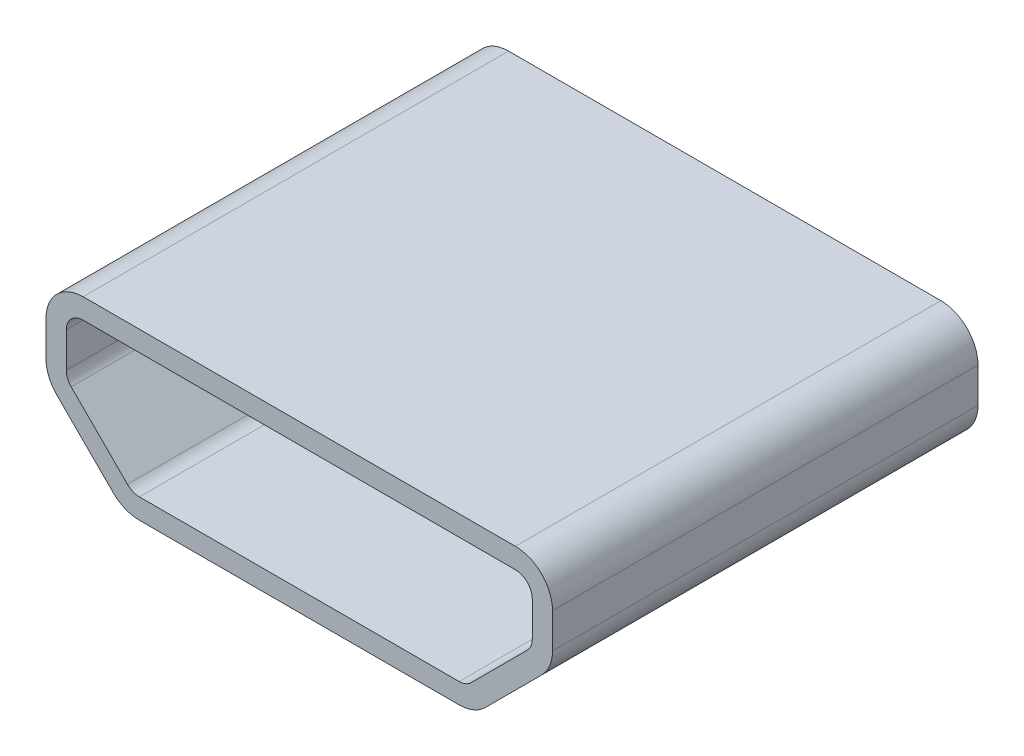
ISO-10303-21;
HEADER;
FILE_DESCRIPTION(('STEP AP214'),'2;1');
FILE_NAME('part.step','',(''),(''),'','','');
FILE_SCHEMA(('AUTOMOTIVE_DESIGN { 1 0 10303 214 1 1 1 1 }'));
ENDSEC;
DATA;
#1=APPLICATION_CONTEXT('core data for automotive mechanical design processes');
#2=APPLICATION_PROTOCOL_DEFINITION('international standard','automotive_design',2000,#1);
#3=PRODUCT_CONTEXT('',#1,'mechanical');
#4=PRODUCT('Part','Part','',(#3));
#5=PRODUCT_RELATED_PRODUCT_CATEGORY('part','',(#4));
#6=PRODUCT_DEFINITION_FORMATION('','',#4);
#7=PRODUCT_DEFINITION_CONTEXT('part definition',#1,'design');
#8=PRODUCT_DEFINITION('design','',#6,#7);
#9=PRODUCT_DEFINITION_SHAPE('','',#8);
#10=(LENGTH_UNIT() NAMED_UNIT(*) SI_UNIT(.MILLI.,.METRE.));
#11=(NAMED_UNIT(*) PLANE_ANGLE_UNIT() SI_UNIT($,.RADIAN.));
#12=(NAMED_UNIT(*) SI_UNIT($,.STERADIAN.) SOLID_ANGLE_UNIT());
#13=UNCERTAINTY_MEASURE_WITH_UNIT(LENGTH_MEASURE(1.E-05),#10,'distance_accuracy_value','');
#14=(GEOMETRIC_REPRESENTATION_CONTEXT(3) GLOBAL_UNCERTAINTY_ASSIGNED_CONTEXT((#13)) GLOBAL_UNIT_ASSIGNED_CONTEXT((#10,
#11,#12)) REPRESENTATION_CONTEXT('',''));
#15=CARTESIAN_POINT('',(0.,0.,0.));
#16=DIRECTION('',(0.,0.,1.));
#17=DIRECTION('',(1.,0.,0.));
#18=AXIS2_PLACEMENT_3D('',#15,#16,#17);
#19=CARTESIAN_POINT('',(-3.2,0.674999999999999,3.15));
#20=DIRECTION('',(0.,0.,-1.));
#21=DIRECTION('',(-1.,0.,0.));
#22=AXIS2_PLACEMENT_3D('',#19,#20,#21);
#23=CYLINDRICAL_SURFACE('',#22,0.55);
#24=DIRECTION('',(0.,0.,-1.));
#25=VECTOR('',#24,1.);
#26=CARTESIAN_POINT('',(-3.2,1.225,3.15));
#27=LINE('',#26,#25);
#28=CARTESIAN_POINT('',(-3.2,1.225,3.15));
#29=VERTEX_POINT('',#28);
#30=CARTESIAN_POINT('',(-3.2,1.225,-3.15));
#31=VERTEX_POINT('',#30);
#32=EDGE_CURVE('E113',#29,#31,#27,.T.);
#33=ORIENTED_EDGE('',*,*,#32,.T.);
#34=CARTESIAN_POINT('',(-3.2,0.674999999999999,-3.15));
#35=DIRECTION('',(0.,0.,1.));
#36=DIRECTION('',(1.,0.,0.));
#37=AXIS2_PLACEMENT_3D('',#34,#35,#36);
#38=CIRCLE('',#37,0.55);
#39=CARTESIAN_POINT('',(-3.75,0.674999999999999,-3.15));
#40=VERTEX_POINT('',#39);
#41=EDGE_CURVE('E180',#31,#40,#38,.T.);
#42=ORIENTED_EDGE('',*,*,#41,.T.);
#43=DIRECTION('',(0.,0.,-1.));
#44=VECTOR('',#43,1.);
#45=CARTESIAN_POINT('',(-3.75,0.674999999999999,3.15));
#46=LINE('',#45,#44);
#47=CARTESIAN_POINT('',(-3.75,0.674999999999999,3.15));
#48=VERTEX_POINT('',#47);
#49=EDGE_CURVE('E12',#48,#40,#46,.T.);
#50=ORIENTED_EDGE('',*,*,#49,.F.);
#51=CARTESIAN_POINT('',(-3.2,0.674999999999999,3.15));
#52=DIRECTION('',(0.,0.,1.));
#53=DIRECTION('',(1.,0.,0.));
#54=AXIS2_PLACEMENT_3D('',#51,#52,#53);
#55=CIRCLE('',#54,0.55);
#56=EDGE_CURVE('E224',#29,#48,#55,.T.);
#57=ORIENTED_EDGE('',*,*,#56,.F.);
#58=EDGE_LOOP('',(#33,#42,#50,#57));
#59=FACE_BOUND('',#58,.T.);
#60=ADVANCED_FACE('F45',(#59),#23,.T.);
#61=CARTESIAN_POINT('',(-3.75,0.674999999999999,3.15));
#62=DIRECTION('',(1.,0.,0.));
#63=DIRECTION('',(0.,1.,0.));
#64=AXIS2_PLACEMENT_3D('',#61,#62,#63);
#65=PLANE('',#64);
#66=ORIENTED_EDGE('',*,*,#49,.T.);
#67=DIRECTION('',(0.,-1.,0.));
#68=VECTOR('',#67,1.);
#69=CARTESIAN_POINT('',(-3.75,0.674999999999999,-3.15));
#70=LINE('',#69,#68);
#71=CARTESIAN_POINT('',(-3.75,0.157817459305192,-3.15));
#72=VERTEX_POINT('',#71);
#73=EDGE_CURVE('E183',#40,#72,#70,.T.);
#74=ORIENTED_EDGE('',*,*,#73,.T.);
#75=DIRECTION('',(0.,0.,-1.));
#76=VECTOR('',#75,1.);
#77=CARTESIAN_POINT('',(-3.75,0.157817459305192,3.15));
#78=LINE('',#77,#76);
#79=CARTESIAN_POINT('',(-3.75,0.157817459305192,3.15));
#80=VERTEX_POINT('',#79);
#81=EDGE_CURVE('E53',#80,#72,#78,.T.);
#82=ORIENTED_EDGE('',*,*,#81,.F.);
#83=DIRECTION('',(0.,-1.,0.));
#84=VECTOR('',#83,1.);
#85=CARTESIAN_POINT('',(-3.75,0.674999999999999,3.15));
#86=LINE('',#85,#84);
#87=EDGE_CURVE('E121',#48,#80,#86,.T.);
#88=ORIENTED_EDGE('',*,*,#87,.F.);
#89=EDGE_LOOP('',(#66,#74,#82,#88));
#90=FACE_BOUND('',#89,.T.);
#91=ADVANCED_FACE('F257',(#90),#65,.F.);
#92=CARTESIAN_POINT('',(-3.2,0.157817459305192,3.15));
#93=DIRECTION('',(0.,0.,-1.));
#94=DIRECTION('',(-1.,0.,0.));
#95=AXIS2_PLACEMENT_3D('',#92,#93,#94);
#96=CYLINDRICAL_SURFACE('',#95,0.55);
#97=ORIENTED_EDGE('',*,*,#81,.T.);
#98=CARTESIAN_POINT('',(-3.2,0.157817459305192,-3.15));
#99=DIRECTION('',(0.,0.,1.));
#100=DIRECTION('',(-1.,0.,0.));
#101=AXIS2_PLACEMENT_3D('',#98,#99,#100);
#102=CIRCLE('',#101,0.55);
#103=CARTESIAN_POINT('',(-3.5889087296526,-0.231091270347411,-3.15));
#104=VERTEX_POINT('',#103);
#105=EDGE_CURVE('E188',#72,#104,#102,.T.);
#106=ORIENTED_EDGE('',*,*,#105,.T.);
#107=DIRECTION('',(0.,0.,-1.));
#108=VECTOR('',#107,1.);
#109=CARTESIAN_POINT('',(-3.5889087296526,-0.231091270347411,3.15));
#110=LINE('',#109,#108);
#111=CARTESIAN_POINT('',(-3.5889087296526,-0.231091270347411,3.15));
#112=VERTEX_POINT('',#111);
#113=EDGE_CURVE('E246',#112,#104,#110,.T.);
#114=ORIENTED_EDGE('',*,*,#113,.F.);
#115=CARTESIAN_POINT('',(-3.2,0.157817459305192,3.15));
#116=DIRECTION('',(0.,0.,1.));
#117=DIRECTION('',(-1.,0.,0.));
#118=AXIS2_PLACEMENT_3D('',#115,#116,#117);
#119=CIRCLE('',#118,0.55);
#120=EDGE_CURVE('E255',#80,#112,#119,.T.);
#121=ORIENTED_EDGE('',*,*,#120,.F.);
#122=EDGE_LOOP('',(#97,#106,#114,#121));
#123=FACE_BOUND('',#122,.T.);
#124=ADVANCED_FACE('F251',(#123),#96,.T.);
#125=CARTESIAN_POINT('',(-2.7560912703474,-1.0639087296526,3.15));
#126=DIRECTION('',(0.707106781186544,0.707106781186551,0.));
#127=DIRECTION('',(-0.707106781186551,0.707106781186544,0.));
#128=AXIS2_PLACEMENT_3D('',#125,#126,#127);
#129=PLANE('',#128);
#130=ORIENTED_EDGE('',*,*,#113,.T.);
#131=DIRECTION('',(0.707106781186551,-0.707106781186544,0.));
#132=VECTOR('',#131,1.);
#133=CARTESIAN_POINT('',(-2.7560912703474,-1.0639087296526,-3.15));
#134=LINE('',#133,#132);
#135=CARTESIAN_POINT('',(-2.7560912703474,-1.0639087296526,-3.15));
#136=VERTEX_POINT('',#135);
#137=EDGE_CURVE('E192',#104,#136,#134,.T.);
#138=ORIENTED_EDGE('',*,*,#137,.T.);
#139=DIRECTION('',(0.,0.,-1.));
#140=VECTOR('',#139,1.);
#141=CARTESIAN_POINT('',(-2.7560912703474,-1.0639087296526,3.15));
#142=LINE('',#141,#140);
#143=CARTESIAN_POINT('',(-2.7560912703474,-1.0639087296526,3.15));
#144=VERTEX_POINT('',#143);
#145=EDGE_CURVE('E243',#144,#136,#142,.T.);
#146=ORIENTED_EDGE('',*,*,#145,.F.);
#147=DIRECTION('',(0.707106781186551,-0.707106781186544,0.));
#148=VECTOR('',#147,1.);
#149=CARTESIAN_POINT('',(-2.7560912703474,-1.0639087296526,3.15));
#150=LINE('',#149,#148);
#151=EDGE_CURVE('E269',#112,#144,#150,.T.);
#152=ORIENTED_EDGE('',*,*,#151,.F.);
#153=EDGE_LOOP('',(#130,#138,#146,#152));
#154=FACE_BOUND('',#153,.T.);
#155=ADVANCED_FACE('F266',(#154),#129,.F.);
#156=CARTESIAN_POINT('',(-2.3671825406948,-0.675,3.15));
#157=DIRECTION('',(0.,0.,-1.));
#158=DIRECTION('',(-1.,0.,0.));
#159=AXIS2_PLACEMENT_3D('',#156,#157,#158);
#160=CYLINDRICAL_SURFACE('',#159,0.55);
#161=ORIENTED_EDGE('',*,*,#145,.T.);
#162=CARTESIAN_POINT('',(-2.3671825406948,-0.675,-3.15));
#163=DIRECTION('',(0.,0.,1.));
#164=DIRECTION('',(-1.,0.,0.));
#165=AXIS2_PLACEMENT_3D('',#162,#163,#164);
#166=CIRCLE('',#165,0.55);
#167=CARTESIAN_POINT('',(-2.3671825406948,-1.225,-3.15));
#168=VERTEX_POINT('',#167);
#169=EDGE_CURVE('E196',#136,#168,#166,.T.);
#170=ORIENTED_EDGE('',*,*,#169,.T.);
#171=DIRECTION('',(0.,0.,-1.));
#172=VECTOR('',#171,1.);
#173=CARTESIAN_POINT('',(-2.3671825406948,-1.225,3.15));
#174=LINE('',#173,#172);
#175=CARTESIAN_POINT('',(-2.3671825406948,-1.225,3.15));
#176=VERTEX_POINT('',#175);
#177=EDGE_CURVE('E240',#176,#168,#174,.T.);
#178=ORIENTED_EDGE('',*,*,#177,.F.);
#179=CARTESIAN_POINT('',(-2.3671825406948,-0.675,3.15));
#180=DIRECTION('',(0.,0.,1.));
#181=DIRECTION('',(-1.,0.,0.));
#182=AXIS2_PLACEMENT_3D('',#179,#180,#181);
#183=CIRCLE('',#182,0.55);
#184=EDGE_CURVE('E271',#144,#176,#183,.T.);
#185=ORIENTED_EDGE('',*,*,#184,.F.);
#186=EDGE_LOOP('',(#161,#170,#178,#185));
#187=FACE_BOUND('',#186,.T.);
#188=ADVANCED_FACE('F565',(#187),#160,.T.);
#189=CARTESIAN_POINT('',(-2.3671825406948,-1.225,3.15));
#190=DIRECTION('',(0.,1.,0.));
#191=DIRECTION('',(-1.,0.,0.));
#192=AXIS2_PLACEMENT_3D('',#189,#190,#191);
#193=PLANE('',#192);
#194=ORIENTED_EDGE('',*,*,#177,.T.);
#195=DIRECTION('',(1.,0.,0.));
#196=VECTOR('',#195,1.);
#197=CARTESIAN_POINT('',(-2.3671825406948,-1.225,-3.15));
#198=LINE('',#197,#196);
#199=CARTESIAN_POINT('',(2.3671825406948,-1.225,-3.15));
#200=VERTEX_POINT('',#199);
#201=EDGE_CURVE('E200',#168,#200,#198,.T.);
#202=ORIENTED_EDGE('',*,*,#201,.T.);
#203=DIRECTION('',(0.,0.,-1.));
#204=VECTOR('',#203,1.);
#205=CARTESIAN_POINT('',(2.3671825406948,-1.225,3.15));
#206=LINE('',#205,#204);
#207=CARTESIAN_POINT('',(2.3671825406948,-1.225,3.15));
#208=VERTEX_POINT('',#207);
#209=EDGE_CURVE('E237',#208,#200,#206,.T.);
#210=ORIENTED_EDGE('',*,*,#209,.F.);
#211=DIRECTION('',(1.,0.,0.));
#212=VECTOR('',#211,1.);
#213=CARTESIAN_POINT('',(-2.3671825406948,-1.225,3.15));
#214=LINE('',#213,#212);
#215=EDGE_CURVE('E275',#176,#208,#214,.T.);
#216=ORIENTED_EDGE('',*,*,#215,.F.);
#217=EDGE_LOOP('',(#194,#202,#210,#216));
#218=FACE_BOUND('',#217,.T.);
#219=ADVANCED_FACE('F568',(#218),#193,.F.);
#220=CARTESIAN_POINT('',(2.3671825406948,-0.675,3.15));
#221=DIRECTION('',(0.,0.,-1.));
#222=DIRECTION('',(-1.,0.,0.));
#223=AXIS2_PLACEMENT_3D('',#220,#221,#222);
#224=CYLINDRICAL_SURFACE('',#223,0.55);
#225=ORIENTED_EDGE('',*,*,#209,.T.);
#226=CARTESIAN_POINT('',(2.3671825406948,-0.675,-3.15));
#227=DIRECTION('',(0.,0.,1.));
#228=DIRECTION('',(1.,0.,0.));
#229=AXIS2_PLACEMENT_3D('',#226,#227,#228);
#230=CIRCLE('',#229,0.55);
#231=CARTESIAN_POINT('',(2.7560912703474,-1.0639087296526,-3.15));
#232=VERTEX_POINT('',#231);
#233=EDGE_CURVE('E204',#200,#232,#230,.T.);
#234=ORIENTED_EDGE('',*,*,#233,.T.);
#235=DIRECTION('',(0.,0.,-1.));
#236=VECTOR('',#235,1.);
#237=CARTESIAN_POINT('',(2.7560912703474,-1.0639087296526,3.15));
#238=LINE('',#237,#236);
#239=CARTESIAN_POINT('',(2.7560912703474,-1.0639087296526,3.15));
#240=VERTEX_POINT('',#239);
#241=EDGE_CURVE('E234',#240,#232,#238,.T.);
#242=ORIENTED_EDGE('',*,*,#241,.F.);
#243=CARTESIAN_POINT('',(2.3671825406948,-0.675,3.15));
#244=DIRECTION('',(0.,0.,1.));
#245=DIRECTION('',(1.,0.,0.));
#246=AXIS2_PLACEMENT_3D('',#243,#244,#245);
#247=CIRCLE('',#246,0.55);
#248=EDGE_CURVE('E282',#208,#240,#247,.T.);
#249=ORIENTED_EDGE('',*,*,#248,.F.);
#250=EDGE_LOOP('',(#225,#234,#242,#249));
#251=FACE_BOUND('',#250,.T.);
#252=ADVANCED_FACE('F572',(#251),#224,.T.);
#253=CARTESIAN_POINT('',(2.7560912703474,-1.0639087296526,3.15));
#254=DIRECTION('',(-0.707106781186544,0.707106781186551,0.));
#255=DIRECTION('',(-0.707106781186551,-0.707106781186544,0.));
#256=AXIS2_PLACEMENT_3D('',#253,#254,#255);
#257=PLANE('',#256);
#258=ORIENTED_EDGE('',*,*,#241,.T.);
#259=DIRECTION('',(0.707106781186551,0.707106781186544,0.));
#260=VECTOR('',#259,1.);
#261=CARTESIAN_POINT('',(2.7560912703474,-1.0639087296526,-3.15));
#262=LINE('',#261,#260);
#263=CARTESIAN_POINT('',(3.5889087296526,-0.231091270347412,-3.15));
#264=VERTEX_POINT('',#263);
#265=EDGE_CURVE('E208',#232,#264,#262,.T.);
#266=ORIENTED_EDGE('',*,*,#265,.T.);
#267=DIRECTION('',(0.,0.,-1.));
#268=VECTOR('',#267,1.);
#269=CARTESIAN_POINT('',(3.5889087296526,-0.231091270347412,3.15));
#270=LINE('',#269,#268);
#271=CARTESIAN_POINT('',(3.5889087296526,-0.231091270347412,3.15));
#272=VERTEX_POINT('',#271);
#273=EDGE_CURVE('E231',#272,#264,#270,.T.);
#274=ORIENTED_EDGE('',*,*,#273,.F.);
#275=DIRECTION('',(0.707106781186551,0.707106781186544,0.));
#276=VECTOR('',#275,1.);
#277=CARTESIAN_POINT('',(2.7560912703474,-1.0639087296526,3.15));
#278=LINE('',#277,#276);
#279=EDGE_CURVE('E285',#240,#272,#278,.T.);
#280=ORIENTED_EDGE('',*,*,#279,.F.);
#281=EDGE_LOOP('',(#258,#266,#274,#280));
#282=FACE_BOUND('',#281,.T.);
#283=ADVANCED_FACE('F293',(#282),#257,.F.);
#284=CARTESIAN_POINT('',(3.2,0.157817459305192,3.15));
#285=DIRECTION('',(0.,0.,-1.));
#286=DIRECTION('',(-1.,0.,0.));
#287=AXIS2_PLACEMENT_3D('',#284,#285,#286);
#288=CYLINDRICAL_SURFACE('',#287,0.55);
#289=ORIENTED_EDGE('',*,*,#273,.T.);
#290=CARTESIAN_POINT('',(3.2,0.157817459305192,-3.15));
#291=DIRECTION('',(0.,0.,1.));
#292=DIRECTION('',(1.,0.,0.));
#293=AXIS2_PLACEMENT_3D('',#290,#291,#292);
#294=CIRCLE('',#293,0.55);
#295=CARTESIAN_POINT('',(3.75,0.157817459305191,-3.15));
#296=VERTEX_POINT('',#295);
#297=EDGE_CURVE('E212',#264,#296,#294,.T.);
#298=ORIENTED_EDGE('',*,*,#297,.T.);
#299=DIRECTION('',(0.,0.,-1.));
#300=VECTOR('',#299,1.);
#301=CARTESIAN_POINT('',(3.75,0.157817459305191,3.15));
#302=LINE('',#301,#300);
#303=CARTESIAN_POINT('',(3.75,0.157817459305191,3.15));
#304=VERTEX_POINT('',#303);
#305=EDGE_CURVE('E170',#304,#296,#302,.T.);
#306=ORIENTED_EDGE('',*,*,#305,.F.);
#307=CARTESIAN_POINT('',(3.2,0.157817459305192,3.15));
#308=DIRECTION('',(0.,0.,1.));
#309=DIRECTION('',(1.,0.,0.));
#310=AXIS2_PLACEMENT_3D('',#307,#308,#309);
#311=CIRCLE('',#310,0.55);
#312=EDGE_CURVE('E156',#272,#304,#311,.T.);
#313=ORIENTED_EDGE('',*,*,#312,.F.);
#314=EDGE_LOOP('',(#289,#298,#306,#313));
#315=FACE_BOUND('',#314,.T.);
#316=ADVANCED_FACE('F297',(#315),#288,.T.);
#317=CARTESIAN_POINT('',(3.75,0.674999999999999,3.15));
#318=DIRECTION('',(-1.,0.,0.));
#319=DIRECTION('',(0.,-1.,0.));
#320=AXIS2_PLACEMENT_3D('',#317,#318,#319);
#321=PLANE('',#320);
#322=ORIENTED_EDGE('',*,*,#305,.T.);
#323=DIRECTION('',(0.,1.,0.));
#324=VECTOR('',#323,1.);
#325=CARTESIAN_POINT('',(3.75,0.674999999999999,-3.15));
#326=LINE('',#325,#324);
#327=CARTESIAN_POINT('',(3.75,0.674999999999999,-3.15));
#328=VERTEX_POINT('',#327);
#329=EDGE_CURVE('E165',#296,#328,#326,.T.);
#330=ORIENTED_EDGE('',*,*,#329,.T.);
#331=DIRECTION('',(0.,0.,-1.));
#332=VECTOR('',#331,1.);
#333=CARTESIAN_POINT('',(3.75,0.674999999999999,3.15));
#334=LINE('',#333,#332);
#335=CARTESIAN_POINT('',(3.75,0.674999999999999,3.15));
#336=VERTEX_POINT('',#335);
#337=EDGE_CURVE('E162',#336,#328,#334,.T.);
#338=ORIENTED_EDGE('',*,*,#337,.F.);
#339=DIRECTION('',(0.,1.,0.));
#340=VECTOR('',#339,1.);
#341=CARTESIAN_POINT('',(3.75,0.674999999999999,3.15));
#342=LINE('',#341,#340);
#343=EDGE_CURVE('E149',#304,#336,#342,.T.);
#344=ORIENTED_EDGE('',*,*,#343,.F.);
#345=EDGE_LOOP('',(#322,#330,#338,#344));
#346=FACE_BOUND('',#345,.T.);
#347=ADVANCED_FACE('F163',(#346),#321,.F.);
#348=CARTESIAN_POINT('',(3.2,0.674999999999999,3.15));
#349=DIRECTION('',(0.,0.,-1.));
#350=DIRECTION('',(-1.,0.,0.));
#351=AXIS2_PLACEMENT_3D('',#348,#349,#350);
#352=CYLINDRICAL_SURFACE('',#351,0.55);
#353=ORIENTED_EDGE('',*,*,#337,.T.);
#354=CARTESIAN_POINT('',(3.2,0.674999999999999,-3.15));
#355=DIRECTION('',(0.,0.,1.));
#356=DIRECTION('',(-1.,0.,0.));
#357=AXIS2_PLACEMENT_3D('',#354,#355,#356);
#358=CIRCLE('',#357,0.55);
#359=CARTESIAN_POINT('',(3.2,1.225,-3.15));
#360=VERTEX_POINT('',#359);
#361=EDGE_CURVE('E218',#328,#360,#358,.T.);
#362=ORIENTED_EDGE('',*,*,#361,.T.);
#363=DIRECTION('',(0.,0.,-1.));
#364=VECTOR('',#363,1.);
#365=CARTESIAN_POINT('',(3.2,1.225,3.15));
#366=LINE('',#365,#364);
#367=CARTESIAN_POINT('',(3.2,1.225,3.15));
#368=VERTEX_POINT('',#367);
#369=EDGE_CURVE('E171',#368,#360,#366,.T.);
#370=ORIENTED_EDGE('',*,*,#369,.F.);
#371=CARTESIAN_POINT('',(3.2,0.674999999999999,3.15));
#372=DIRECTION('',(0.,0.,1.));
#373=DIRECTION('',(-1.,0.,0.));
#374=AXIS2_PLACEMENT_3D('',#371,#372,#373);
#375=CIRCLE('',#374,0.55);
#376=EDGE_CURVE('E153',#336,#368,#375,.T.);
#377=ORIENTED_EDGE('',*,*,#376,.F.);
#378=EDGE_LOOP('',(#353,#362,#370,#377));
#379=FACE_BOUND('',#378,.T.);
#380=ADVANCED_FACE('F173',(#379),#352,.T.);
#381=CARTESIAN_POINT('',(3.2,1.225,3.15));
#382=DIRECTION('',(0.,-1.,0.));
#383=DIRECTION('',(0.,0.,-1.));
#384=AXIS2_PLACEMENT_3D('',#381,#382,#383);
#385=PLANE('',#384);
#386=ORIENTED_EDGE('',*,*,#369,.T.);
#387=DIRECTION('',(-1.,0.,0.));
#388=VECTOR('',#387,1.);
#389=CARTESIAN_POINT('',(3.2,1.225,-3.15));
#390=LINE('',#389,#388);
#391=EDGE_CURVE('E221',#360,#31,#390,.T.);
#392=ORIENTED_EDGE('',*,*,#391,.T.);
#393=ORIENTED_EDGE('',*,*,#32,.F.);
#394=DIRECTION('',(-1.,0.,0.));
#395=VECTOR('',#394,1.);
#396=CARTESIAN_POINT('',(3.2,1.225,3.15));
#397=LINE('',#396,#395);
#398=EDGE_CURVE('E69',#368,#29,#397,.T.);
#399=ORIENTED_EDGE('',*,*,#398,.F.);
#400=EDGE_LOOP('',(#386,#392,#393,#399));
#401=FACE_BOUND('',#400,.T.);
#402=ADVANCED_FACE('F300',(#401),#385,.F.);
#403=CARTESIAN_POINT('',(-3.2,0.674999999999999,3.15));
#404=DIRECTION('',(0.,0.,1.));
#405=DIRECTION('',(1.,0.,0.));
#406=AXIS2_PLACEMENT_3D('',#403,#404,#405);
#407=PLANE('',#406);
#408=CARTESIAN_POINT('',(-3.2,0.674999999999999,3.15));
#409=DIRECTION('',(0.,0.,1.));
#410=DIRECTION('',(1.,0.,0.));
#411=AXIS2_PLACEMENT_3D('',#408,#409,#410);
#412=CIRCLE('',#411,0.25);
#413=CARTESIAN_POINT('',(-3.2,0.924999999999999,3.15));
#414=VERTEX_POINT('',#413);
#415=CARTESIAN_POINT('',(-3.45,0.674999999999999,3.15));
#416=VERTEX_POINT('',#415);
#417=EDGE_CURVE('E60',#414,#416,#412,.T.);
#418=ORIENTED_EDGE('',*,*,#417,.F.);
#419=DIRECTION('',(-1.,0.,0.));
#420=VECTOR('',#419,1.);
#421=CARTESIAN_POINT('',(3.2,0.924999999999999,3.15));
#422=LINE('',#421,#420);
#423=CARTESIAN_POINT('',(3.2,0.924999999999999,3.15));
#424=VERTEX_POINT('',#423);
#425=EDGE_CURVE('E351',#424,#414,#422,.T.);
#426=ORIENTED_EDGE('',*,*,#425,.F.);
#427=CARTESIAN_POINT('',(3.2,0.674999999999999,3.15));
#428=DIRECTION('',(0.,0.,1.));
#429=DIRECTION('',(1.,0.,0.));
#430=AXIS2_PLACEMENT_3D('',#427,#428,#429);
#431=CIRCLE('',#430,0.25);
#432=CARTESIAN_POINT('',(3.45,0.675,3.15));
#433=VERTEX_POINT('',#432);
#434=EDGE_CURVE('E356',#433,#424,#431,.T.);
#435=ORIENTED_EDGE('',*,*,#434,.F.);
#436=DIRECTION('',(0.,1.,0.));
#437=VECTOR('',#436,1.);
#438=CARTESIAN_POINT('',(3.45,0.157817459305191,3.15));
#439=LINE('',#438,#437);
#440=CARTESIAN_POINT('',(3.45,0.157817459305191,3.15));
#441=VERTEX_POINT('',#440);
#442=EDGE_CURVE('E360',#441,#433,#439,.T.);
#443=ORIENTED_EDGE('',*,*,#442,.F.);
#444=CARTESIAN_POINT('',(3.2,0.157817459305192,3.15));
#445=DIRECTION('',(0.,0.,1.));
#446=DIRECTION('',(1.,0.,0.));
#447=AXIS2_PLACEMENT_3D('',#444,#445,#446);
#448=CIRCLE('',#447,0.25);
#449=CARTESIAN_POINT('',(3.37677669529663,-0.0189592359914465,3.15));
#450=VERTEX_POINT('',#449);
#451=EDGE_CURVE('E364',#450,#441,#448,.T.);
#452=ORIENTED_EDGE('',*,*,#451,.F.);
#453=DIRECTION('',(0.707106781186551,0.707106781186544,0.));
#454=VECTOR('',#453,1.);
#455=CARTESIAN_POINT('',(2.54395923599144,-0.851776695296637,3.15));
#456=LINE('',#455,#454);
#457=CARTESIAN_POINT('',(2.54395923599144,-0.851776695296637,3.15));
#458=VERTEX_POINT('',#457);
#459=EDGE_CURVE('E368',#458,#450,#456,.T.);
#460=ORIENTED_EDGE('',*,*,#459,.F.);
#461=CARTESIAN_POINT('',(2.3671825406948,-0.675,3.15));
#462=DIRECTION('',(0.,0.,1.));
#463=DIRECTION('',(1.,0.,0.));
#464=AXIS2_PLACEMENT_3D('',#461,#462,#463);
#465=CIRCLE('',#464,0.25);
#466=CARTESIAN_POINT('',(2.3671825406948,-0.925,3.15));
#467=VERTEX_POINT('',#466);
#468=EDGE_CURVE('E372',#467,#458,#465,.T.);
#469=ORIENTED_EDGE('',*,*,#468,.F.);
#470=DIRECTION('',(1.,0.,0.));
#471=VECTOR('',#470,1.);
#472=CARTESIAN_POINT('',(-2.3671825406948,-0.925,3.15));
#473=LINE('',#472,#471);
#474=CARTESIAN_POINT('',(-2.3671825406948,-0.925,3.15));
#475=VERTEX_POINT('',#474);
#476=EDGE_CURVE('E376',#475,#467,#473,.T.);
#477=ORIENTED_EDGE('',*,*,#476,.F.);
#478=CARTESIAN_POINT('',(-2.3671825406948,-0.675,3.15));
#479=DIRECTION('',(0.,0.,1.));
#480=DIRECTION('',(1.,0.,0.));
#481=AXIS2_PLACEMENT_3D('',#478,#479,#480);
#482=CIRCLE('',#481,0.25);
#483=CARTESIAN_POINT('',(-2.54395923599144,-0.851776695296637,3.15));
#484=VERTEX_POINT('',#483);
#485=EDGE_CURVE('E380',#484,#475,#482,.T.);
#486=ORIENTED_EDGE('',*,*,#485,.F.);
#487=DIRECTION('',(0.707106781186552,-0.707106781186543,0.));
#488=VECTOR('',#487,1.);
#489=CARTESIAN_POINT('',(-3.37677669529664,-0.0189592359914461,3.15));
#490=LINE('',#489,#488);
#491=CARTESIAN_POINT('',(-3.37677669529664,-0.0189592359914461,3.15));
#492=VERTEX_POINT('',#491);
#493=EDGE_CURVE('E384',#492,#484,#490,.T.);
#494=ORIENTED_EDGE('',*,*,#493,.F.);
#495=CARTESIAN_POINT('',(-3.2,0.157817459305192,3.15));
#496=DIRECTION('',(0.,0.,1.));
#497=DIRECTION('',(1.,0.,0.));
#498=AXIS2_PLACEMENT_3D('',#495,#496,#497);
#499=CIRCLE('',#498,0.25);
#500=CARTESIAN_POINT('',(-3.45,0.157817459305192,3.15));
#501=VERTEX_POINT('',#500);
#502=EDGE_CURVE('E388',#501,#492,#499,.T.);
#503=ORIENTED_EDGE('',*,*,#502,.F.);
#504=DIRECTION('',(0.,-1.,0.));
#505=VECTOR('',#504,1.);
#506=CARTESIAN_POINT('',(-3.45,0.674999999999999,3.15));
#507=LINE('',#506,#505);
#508=EDGE_CURVE('E392',#416,#501,#507,.T.);
#509=ORIENTED_EDGE('',*,*,#508,.F.);
#510=EDGE_LOOP('',(#418,#426,#435,#443,#452,#460,#469,#477,#486,#494,#503,#509));
#511=FACE_BOUND('',#510,.T.);
#512=ORIENTED_EDGE('',*,*,#56,.T.);
#513=ORIENTED_EDGE('',*,*,#87,.T.);
#514=ORIENTED_EDGE('',*,*,#120,.T.);
#515=ORIENTED_EDGE('',*,*,#151,.T.);
#516=ORIENTED_EDGE('',*,*,#184,.T.);
#517=ORIENTED_EDGE('',*,*,#215,.T.);
#518=ORIENTED_EDGE('',*,*,#248,.T.);
#519=ORIENTED_EDGE('',*,*,#279,.T.);
#520=ORIENTED_EDGE('',*,*,#312,.T.);
#521=ORIENTED_EDGE('',*,*,#343,.T.);
#522=ORIENTED_EDGE('',*,*,#376,.T.);
#523=ORIENTED_EDGE('',*,*,#398,.T.);
#524=EDGE_LOOP('',(#512,#513,#514,#515,#516,#517,#518,#519,#520,#521,#522,#523));
#525=FACE_BOUND('',#524,.T.);
#526=ADVANCED_FACE('F151',(#511,#525),#407,.T.);
#527=CARTESIAN_POINT('',(-3.2,0.674999999999999,-3.15));
#528=DIRECTION('',(0.,0.,1.));
#529=DIRECTION('',(1.,0.,0.));
#530=AXIS2_PLACEMENT_3D('',#527,#528,#529);
#531=PLANE('',#530);
#532=ORIENTED_EDGE('',*,*,#41,.F.);
#533=ORIENTED_EDGE('',*,*,#391,.F.);
#534=ORIENTED_EDGE('',*,*,#361,.F.);
#535=ORIENTED_EDGE('',*,*,#329,.F.);
#536=ORIENTED_EDGE('',*,*,#297,.F.);
#537=ORIENTED_EDGE('',*,*,#265,.F.);
#538=ORIENTED_EDGE('',*,*,#233,.F.);
#539=ORIENTED_EDGE('',*,*,#201,.F.);
#540=ORIENTED_EDGE('',*,*,#169,.F.);
#541=ORIENTED_EDGE('',*,*,#137,.F.);
#542=ORIENTED_EDGE('',*,*,#105,.F.);
#543=ORIENTED_EDGE('',*,*,#73,.F.);
#544=EDGE_LOOP('',(#532,#533,#534,#535,#536,#537,#538,#539,#540,#541,#542,#543));
#545=FACE_BOUND('',#544,.T.);
#546=ADVANCED_FACE('F261',(#545),#531,.F.);
#547=CARTESIAN_POINT('',(-3.2,0.674999999999999,-0.35));
#548=DIRECTION('',(0.,0.,1.));
#549=DIRECTION('',(1.,0.,0.));
#550=AXIS2_PLACEMENT_3D('',#547,#548,#549);
#551=CYLINDRICAL_SURFACE('',#550,0.25);
#552=ORIENTED_EDGE('',*,*,#417,.T.);
#553=DIRECTION('',(0.,0.,1.));
#554=VECTOR('',#553,1.);
#555=CARTESIAN_POINT('',(-3.45,0.674999999999999,-0.35));
#556=LINE('',#555,#554);
#557=CARTESIAN_POINT('',(-3.45,0.674999999999999,-0.35));
#558=VERTEX_POINT('',#557);
#559=EDGE_CURVE('E305',#558,#416,#556,.T.);
#560=ORIENTED_EDGE('',*,*,#559,.F.);
#561=CARTESIAN_POINT('',(-3.2,0.674999999999999,-0.35));
#562=DIRECTION('',(0.,0.,1.));
#563=DIRECTION('',(1.,0.,0.));
#564=AXIS2_PLACEMENT_3D('',#561,#562,#563);
#565=CIRCLE('',#564,0.25);
#566=CARTESIAN_POINT('',(-3.2,0.924999999999999,-0.35));
#567=VERTEX_POINT('',#566);
#568=EDGE_CURVE('E355',#567,#558,#565,.T.);
#569=ORIENTED_EDGE('',*,*,#568,.F.);
#570=DIRECTION('',(0.,0.,1.));
#571=VECTOR('',#570,1.);
#572=CARTESIAN_POINT('',(-3.2,0.924999999999999,-0.35));
#573=LINE('',#572,#571);
#574=EDGE_CURVE('E184',#567,#414,#573,.T.);
#575=ORIENTED_EDGE('',*,*,#574,.T.);
#576=EDGE_LOOP('',(#552,#560,#569,#575));
#577=FACE_BOUND('',#576,.T.);
#578=ADVANCED_FACE('F451',(#577),#551,.F.);
#579=CARTESIAN_POINT('',(3.2,0.924999999999999,-0.35));
#580=DIRECTION('',(0.,1.,0.));
#581=DIRECTION('',(0.,0.,1.));
#582=AXIS2_PLACEMENT_3D('',#579,#580,#581);
#583=PLANE('',#582);
#584=ORIENTED_EDGE('',*,*,#425,.T.);
#585=ORIENTED_EDGE('',*,*,#574,.F.);
#586=DIRECTION('',(-1.,0.,0.));
#587=VECTOR('',#586,1.);
#588=CARTESIAN_POINT('',(3.2,0.924999999999999,-0.35));
#589=LINE('',#588,#587);
#590=CARTESIAN_POINT('',(3.2,0.924999999999999,-0.35));
#591=VERTEX_POINT('',#590);
#592=EDGE_CURVE('E309',#591,#567,#589,.T.);
#593=ORIENTED_EDGE('',*,*,#592,.F.);
#594=DIRECTION('',(0.,0.,1.));
#595=VECTOR('',#594,1.);
#596=CARTESIAN_POINT('',(3.2,0.924999999999999,-0.35));
#597=LINE('',#596,#595);
#598=EDGE_CURVE('E345',#591,#424,#597,.T.);
#599=ORIENTED_EDGE('',*,*,#598,.T.);
#600=EDGE_LOOP('',(#584,#585,#593,#599));
#601=FACE_BOUND('',#600,.T.);
#602=ADVANCED_FACE('F479',(#601),#583,.F.);
#603=CARTESIAN_POINT('',(3.2,0.674999999999999,-0.35));
#604=DIRECTION('',(0.,0.,1.));
#605=DIRECTION('',(1.,0.,0.));
#606=AXIS2_PLACEMENT_3D('',#603,#604,#605);
#607=CYLINDRICAL_SURFACE('',#606,0.25);
#608=ORIENTED_EDGE('',*,*,#434,.T.);
#609=ORIENTED_EDGE('',*,*,#598,.F.);
#610=CARTESIAN_POINT('',(3.2,0.674999999999999,-0.35));
#611=DIRECTION('',(0.,0.,1.));
#612=DIRECTION('',(1.,0.,0.));
#613=AXIS2_PLACEMENT_3D('',#610,#611,#612);
#614=CIRCLE('',#613,0.25);
#615=CARTESIAN_POINT('',(3.45,0.675,-0.35));
#616=VERTEX_POINT('',#615);
#617=EDGE_CURVE('E401',#616,#591,#614,.T.);
#618=ORIENTED_EDGE('',*,*,#617,.F.);
#619=DIRECTION('',(0.,0.,1.));
#620=VECTOR('',#619,1.);
#621=CARTESIAN_POINT('',(3.45,0.675,-0.35));
#622=LINE('',#621,#620);
#623=EDGE_CURVE('E341',#616,#433,#622,.T.);
#624=ORIENTED_EDGE('',*,*,#623,.T.);
#625=EDGE_LOOP('',(#608,#609,#618,#624));
#626=FACE_BOUND('',#625,.T.);
#627=ADVANCED_FACE('F484',(#626),#607,.F.);
#628=CARTESIAN_POINT('',(3.45,0.157817459305191,-0.35));
#629=DIRECTION('',(1.,0.,0.));
#630=DIRECTION('',(0.,1.,0.));
#631=AXIS2_PLACEMENT_3D('',#628,#629,#630);
#632=PLANE('',#631);
#633=ORIENTED_EDGE('',*,*,#442,.T.);
#634=ORIENTED_EDGE('',*,*,#623,.F.);
#635=DIRECTION('',(0.,1.,0.));
#636=VECTOR('',#635,1.);
#637=CARTESIAN_POINT('',(3.45,0.157817459305191,-0.35));
#638=LINE('',#637,#636);
#639=CARTESIAN_POINT('',(3.45,0.157817459305191,-0.35));
#640=VERTEX_POINT('',#639);
#641=EDGE_CURVE('E405',#640,#616,#638,.T.);
#642=ORIENTED_EDGE('',*,*,#641,.F.);
#643=DIRECTION('',(0.,0.,1.));
#644=VECTOR('',#643,1.);
#645=CARTESIAN_POINT('',(3.45,0.157817459305191,-0.35));
#646=LINE('',#645,#644);
#647=EDGE_CURVE('E337',#640,#441,#646,.T.);
#648=ORIENTED_EDGE('',*,*,#647,.T.);
#649=EDGE_LOOP('',(#633,#634,#642,#648));
#650=FACE_BOUND('',#649,.T.);
#651=ADVANCED_FACE('F522',(#650),#632,.F.);
#652=CARTESIAN_POINT('',(3.2,0.157817459305192,-0.35));
#653=DIRECTION('',(0.,0.,1.));
#654=DIRECTION('',(1.,0.,0.));
#655=AXIS2_PLACEMENT_3D('',#652,#653,#654);
#656=CYLINDRICAL_SURFACE('',#655,0.25);
#657=ORIENTED_EDGE('',*,*,#451,.T.);
#658=ORIENTED_EDGE('',*,*,#647,.F.);
#659=CARTESIAN_POINT('',(3.2,0.157817459305192,-0.35));
#660=DIRECTION('',(0.,0.,1.));
#661=DIRECTION('',(1.,0.,0.));
#662=AXIS2_PLACEMENT_3D('',#659,#660,#661);
#663=CIRCLE('',#662,0.25);
#664=CARTESIAN_POINT('',(3.37677669529663,-0.0189592359914465,-0.35));
#665=VERTEX_POINT('',#664);
#666=EDGE_CURVE('E409',#665,#640,#663,.T.);
#667=ORIENTED_EDGE('',*,*,#666,.F.);
#668=DIRECTION('',(0.,0.,1.));
#669=VECTOR('',#668,1.);
#670=CARTESIAN_POINT('',(3.37677669529663,-0.0189592359914465,-0.35));
#671=LINE('',#670,#669);
#672=EDGE_CURVE('E333',#665,#450,#671,.T.);
#673=ORIENTED_EDGE('',*,*,#672,.T.);
#674=EDGE_LOOP('',(#657,#658,#667,#673));
#675=FACE_BOUND('',#674,.T.);
#676=ADVANCED_FACE('F526',(#675),#656,.F.);
#677=CARTESIAN_POINT('',(2.54395923599144,-0.851776695296637,-0.35));
#678=DIRECTION('',(0.707106781186544,-0.707106781186551,0.));
#679=DIRECTION('',(0.707106781186551,0.707106781186544,0.));
#680=AXIS2_PLACEMENT_3D('',#677,#678,#679);
#681=PLANE('',#680);
#682=ORIENTED_EDGE('',*,*,#459,.T.);
#683=ORIENTED_EDGE('',*,*,#672,.F.);
#684=DIRECTION('',(0.707106781186551,0.707106781186544,0.));
#685=VECTOR('',#684,1.);
#686=CARTESIAN_POINT('',(2.54395923599144,-0.851776695296637,-0.35));
#687=LINE('',#686,#685);
#688=CARTESIAN_POINT('',(2.54395923599144,-0.851776695296637,-0.35));
#689=VERTEX_POINT('',#688);
#690=EDGE_CURVE('E413',#689,#665,#687,.T.);
#691=ORIENTED_EDGE('',*,*,#690,.F.);
#692=DIRECTION('',(0.,0.,1.));
#693=VECTOR('',#692,1.);
#694=CARTESIAN_POINT('',(2.54395923599144,-0.851776695296637,-0.35));
#695=LINE('',#694,#693);
#696=EDGE_CURVE('E329',#689,#458,#695,.T.);
#697=ORIENTED_EDGE('',*,*,#696,.T.);
#698=EDGE_LOOP('',(#682,#683,#691,#697));
#699=FACE_BOUND('',#698,.T.);
#700=ADVANCED_FACE('F532',(#699),#681,.F.);
#701=CARTESIAN_POINT('',(2.3671825406948,-0.675,-0.35));
#702=DIRECTION('',(0.,0.,1.));
#703=DIRECTION('',(1.,0.,0.));
#704=AXIS2_PLACEMENT_3D('',#701,#702,#703);
#705=CYLINDRICAL_SURFACE('',#704,0.25);
#706=ORIENTED_EDGE('',*,*,#468,.T.);
#707=ORIENTED_EDGE('',*,*,#696,.F.);
#708=CARTESIAN_POINT('',(2.3671825406948,-0.675,-0.35));
#709=DIRECTION('',(0.,0.,1.));
#710=DIRECTION('',(1.,0.,0.));
#711=AXIS2_PLACEMENT_3D('',#708,#709,#710);
#712=CIRCLE('',#711,0.25);
#713=CARTESIAN_POINT('',(2.3671825406948,-0.925,-0.35));
#714=VERTEX_POINT('',#713);
#715=EDGE_CURVE('E417',#714,#689,#712,.T.);
#716=ORIENTED_EDGE('',*,*,#715,.F.);
#717=DIRECTION('',(0.,0.,1.));
#718=VECTOR('',#717,1.);
#719=CARTESIAN_POINT('',(2.3671825406948,-0.925,-0.35));
#720=LINE('',#719,#718);
#721=EDGE_CURVE('E325',#714,#467,#720,.T.);
#722=ORIENTED_EDGE('',*,*,#721,.T.);
#723=EDGE_LOOP('',(#706,#707,#716,#722));
#724=FACE_BOUND('',#723,.T.);
#725=ADVANCED_FACE('F535',(#724),#705,.F.);
#726=CARTESIAN_POINT('',(-2.3671825406948,-0.925,-0.35));
#727=DIRECTION('',(0.,-1.,0.));
#728=DIRECTION('',(1.,0.,0.));
#729=AXIS2_PLACEMENT_3D('',#726,#727,#728);
#730=PLANE('',#729);
#731=ORIENTED_EDGE('',*,*,#476,.T.);
#732=ORIENTED_EDGE('',*,*,#721,.F.);
#733=DIRECTION('',(1.,0.,0.));
#734=VECTOR('',#733,1.);
#735=CARTESIAN_POINT('',(-2.3671825406948,-0.925,-0.35));
#736=LINE('',#735,#734);
#737=CARTESIAN_POINT('',(-2.3671825406948,-0.925,-0.35));
#738=VERTEX_POINT('',#737);
#739=EDGE_CURVE('E421',#738,#714,#736,.T.);
#740=ORIENTED_EDGE('',*,*,#739,.F.);
#741=DIRECTION('',(0.,0.,1.));
#742=VECTOR('',#741,1.);
#743=CARTESIAN_POINT('',(-2.3671825406948,-0.925,-0.35));
#744=LINE('',#743,#742);
#745=EDGE_CURVE('E321',#738,#475,#744,.T.);
#746=ORIENTED_EDGE('',*,*,#745,.T.);
#747=EDGE_LOOP('',(#731,#732,#740,#746));
#748=FACE_BOUND('',#747,.T.);
#749=ADVANCED_FACE('F538',(#748),#730,.F.);
#750=CARTESIAN_POINT('',(-2.3671825406948,-0.675,-0.35));
#751=DIRECTION('',(0.,0.,1.));
#752=DIRECTION('',(1.,0.,0.));
#753=AXIS2_PLACEMENT_3D('',#750,#751,#752);
#754=CYLINDRICAL_SURFACE('',#753,0.25);
#755=ORIENTED_EDGE('',*,*,#485,.T.);
#756=ORIENTED_EDGE('',*,*,#745,.F.);
#757=CARTESIAN_POINT('',(-2.3671825406948,-0.675,-0.35));
#758=DIRECTION('',(0.,0.,1.));
#759=DIRECTION('',(1.,0.,0.));
#760=AXIS2_PLACEMENT_3D('',#757,#758,#759);
#761=CIRCLE('',#760,0.25);
#762=CARTESIAN_POINT('',(-2.54395923599144,-0.851776695296637,-0.35));
#763=VERTEX_POINT('',#762);
#764=EDGE_CURVE('E425',#763,#738,#761,.T.);
#765=ORIENTED_EDGE('',*,*,#764,.F.);
#766=DIRECTION('',(0.,0.,1.));
#767=VECTOR('',#766,1.);
#768=CARTESIAN_POINT('',(-2.54395923599144,-0.851776695296637,-0.35));
#769=LINE('',#768,#767);
#770=EDGE_CURVE('E317',#763,#484,#769,.T.);
#771=ORIENTED_EDGE('',*,*,#770,.T.);
#772=EDGE_LOOP('',(#755,#756,#765,#771));
#773=FACE_BOUND('',#772,.T.);
#774=ADVANCED_FACE('F541',(#773),#754,.F.);
#775=CARTESIAN_POINT('',(-3.37677669529664,-0.0189592359914461,-0.35));
#776=DIRECTION('',(-0.707106781186544,-0.707106781186552,0.));
#777=DIRECTION('',(0.707106781186552,-0.707106781186544,0.));
#778=AXIS2_PLACEMENT_3D('',#775,#776,#777);
#779=PLANE('',#778);
#780=ORIENTED_EDGE('',*,*,#493,.T.);
#781=ORIENTED_EDGE('',*,*,#770,.F.);
#782=DIRECTION('',(0.707106781186552,-0.707106781186543,0.));
#783=VECTOR('',#782,1.);
#784=CARTESIAN_POINT('',(-3.37677669529664,-0.0189592359914461,-0.35));
#785=LINE('',#784,#783);
#786=CARTESIAN_POINT('',(-3.37677669529664,-0.0189592359914461,-0.35));
#787=VERTEX_POINT('',#786);
#788=EDGE_CURVE('E429',#787,#763,#785,.T.);
#789=ORIENTED_EDGE('',*,*,#788,.F.);
#790=DIRECTION('',(0.,0.,1.));
#791=VECTOR('',#790,1.);
#792=CARTESIAN_POINT('',(-3.37677669529664,-0.0189592359914461,-0.35));
#793=LINE('',#792,#791);
#794=EDGE_CURVE('E313',#787,#492,#793,.T.);
#795=ORIENTED_EDGE('',*,*,#794,.T.);
#796=EDGE_LOOP('',(#780,#781,#789,#795));
#797=FACE_BOUND('',#796,.T.);
#798=ADVANCED_FACE('F544',(#797),#779,.F.);
#799=CARTESIAN_POINT('',(-3.2,0.157817459305192,-0.35));
#800=DIRECTION('',(0.,0.,1.));
#801=DIRECTION('',(1.,0.,0.));
#802=AXIS2_PLACEMENT_3D('',#799,#800,#801);
#803=CYLINDRICAL_SURFACE('',#802,0.25);
#804=ORIENTED_EDGE('',*,*,#502,.T.);
#805=ORIENTED_EDGE('',*,*,#794,.F.);
#806=CARTESIAN_POINT('',(-3.2,0.157817459305192,-0.35));
#807=DIRECTION('',(0.,0.,1.));
#808=DIRECTION('',(1.,0.,0.));
#809=AXIS2_PLACEMENT_3D('',#806,#807,#808);
#810=CIRCLE('',#809,0.25);
#811=CARTESIAN_POINT('',(-3.45,0.157817459305192,-0.35));
#812=VERTEX_POINT('',#811);
#813=EDGE_CURVE('E433',#812,#787,#810,.T.);
#814=ORIENTED_EDGE('',*,*,#813,.F.);
#815=DIRECTION('',(0.,0.,1.));
#816=VECTOR('',#815,1.);
#817=CARTESIAN_POINT('',(-3.45,0.157817459305192,-0.35));
#818=LINE('',#817,#816);
#819=EDGE_CURVE('E308',#812,#501,#818,.T.);
#820=ORIENTED_EDGE('',*,*,#819,.T.);
#821=EDGE_LOOP('',(#804,#805,#814,#820));
#822=FACE_BOUND('',#821,.T.);
#823=ADVANCED_FACE('F499',(#822),#803,.F.);
#824=CARTESIAN_POINT('',(-3.45,0.674999999999999,-0.35));
#825=DIRECTION('',(-1.,0.,0.));
#826=DIRECTION('',(0.,0.,1.));
#827=AXIS2_PLACEMENT_3D('',#824,#825,#826);
#828=PLANE('',#827);
#829=ORIENTED_EDGE('',*,*,#508,.T.);
#830=ORIENTED_EDGE('',*,*,#819,.F.);
#831=DIRECTION('',(0.,-1.,0.));
#832=VECTOR('',#831,1.);
#833=CARTESIAN_POINT('',(-3.45,0.674999999999999,-0.35));
#834=LINE('',#833,#832);
#835=EDGE_CURVE('E437',#558,#812,#834,.T.);
#836=ORIENTED_EDGE('',*,*,#835,.F.);
#837=ORIENTED_EDGE('',*,*,#559,.T.);
#838=EDGE_LOOP('',(#829,#830,#836,#837));
#839=FACE_BOUND('',#838,.T.);
#840=ADVANCED_FACE('F493',(#839),#828,.F.);
#841=CARTESIAN_POINT('',(-3.2,0.674999999999999,-0.35));
#842=DIRECTION('',(0.,0.,1.));
#843=DIRECTION('',(1.,0.,0.));
#844=AXIS2_PLACEMENT_3D('',#841,#842,#843);
#845=PLANE('',#844);
#846=ORIENTED_EDGE('',*,*,#568,.T.);
#847=ORIENTED_EDGE('',*,*,#835,.T.);
#848=ORIENTED_EDGE('',*,*,#813,.T.);
#849=ORIENTED_EDGE('',*,*,#788,.T.);
#850=ORIENTED_EDGE('',*,*,#764,.T.);
#851=ORIENTED_EDGE('',*,*,#739,.T.);
#852=ORIENTED_EDGE('',*,*,#715,.T.);
#853=ORIENTED_EDGE('',*,*,#690,.T.);
#854=ORIENTED_EDGE('',*,*,#666,.T.);
#855=ORIENTED_EDGE('',*,*,#641,.T.);
#856=ORIENTED_EDGE('',*,*,#617,.T.);
#857=ORIENTED_EDGE('',*,*,#592,.T.);
#858=EDGE_LOOP('',(#846,#847,#848,#849,#850,#851,#852,#853,#854,#855,#856,#857));
#859=FACE_BOUND('',#858,.T.);
#860=ADVANCED_FACE('F446',(#859),#845,.T.);
#861=CLOSED_SHELL('',(#60,#91,#124,#155,#188,#219,#252,#283,#316,#347,#380,#402,#526,#546,#578,
#602,#627,#651,#676,#700,#725,#749,#774,#798,#823,#840,#860));
#862=MANIFOLD_SOLID_BREP('B2',#861);
#863=ADVANCED_BREP_SHAPE_REPRESENTATION('',(#18,#862),#14);
#864=SHAPE_DEFINITION_REPRESENTATION(#9,#863);
ENDSEC;
END-ISO-10303-21;
